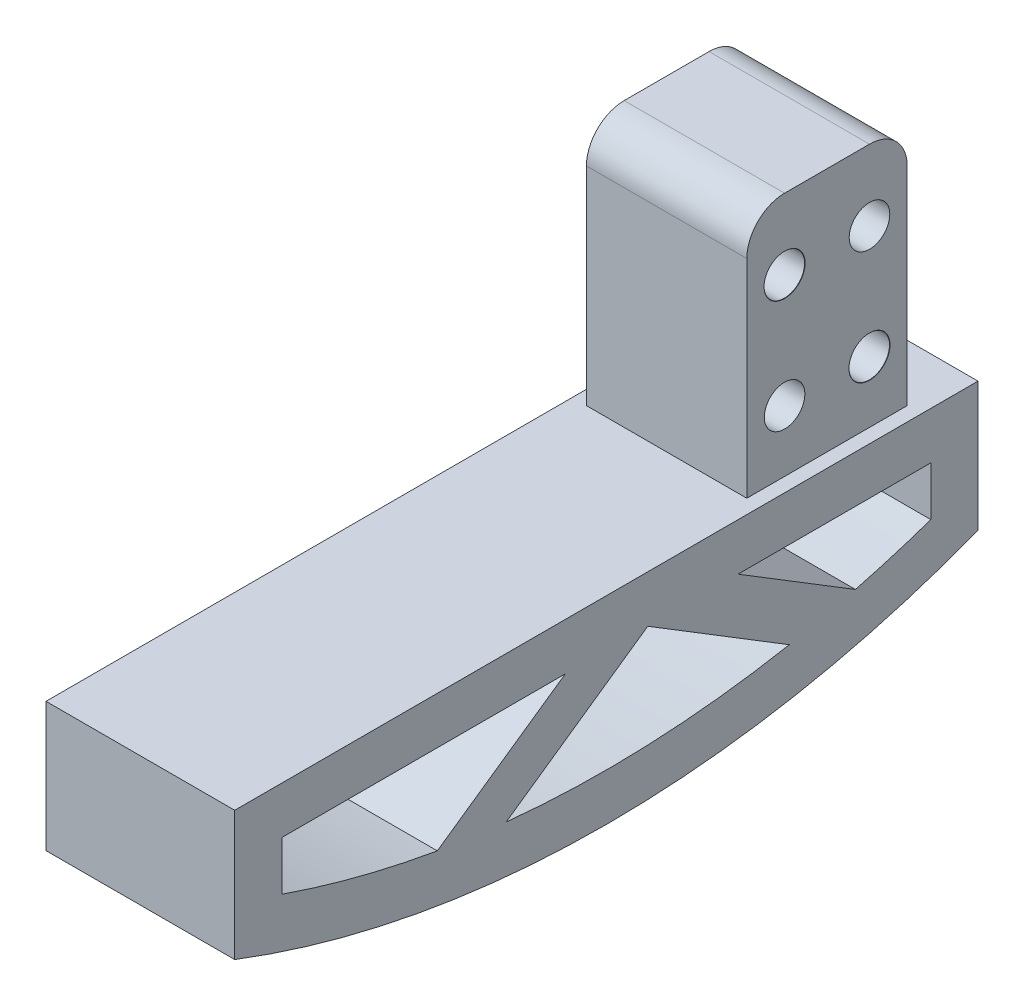
ISO-10303-21;
HEADER;
FILE_DESCRIPTION(('STEP AP214'),'2;1');
FILE_NAME('part.step','',(''),(''),'','','');
FILE_SCHEMA(('AUTOMOTIVE_DESIGN { 1 0 10303 214 1 1 1 1 }'));
ENDSEC;
DATA;
#1=APPLICATION_CONTEXT('core data for automotive mechanical design processes');
#2=APPLICATION_PROTOCOL_DEFINITION('international standard','automotive_design',2000,#1);
#3=PRODUCT_CONTEXT('',#1,'mechanical');
#4=PRODUCT('Part','Part','',(#3));
#5=PRODUCT_RELATED_PRODUCT_CATEGORY('part','',(#4));
#6=PRODUCT_DEFINITION_FORMATION('','',#4);
#7=PRODUCT_DEFINITION_CONTEXT('part definition',#1,'design');
#8=PRODUCT_DEFINITION('design','',#6,#7);
#9=PRODUCT_DEFINITION_SHAPE('','',#8);
#10=(LENGTH_UNIT() NAMED_UNIT(*) SI_UNIT(.MILLI.,.METRE.));
#11=(NAMED_UNIT(*) PLANE_ANGLE_UNIT() SI_UNIT($,.RADIAN.));
#12=(NAMED_UNIT(*) SI_UNIT($,.STERADIAN.) SOLID_ANGLE_UNIT());
#13=UNCERTAINTY_MEASURE_WITH_UNIT(LENGTH_MEASURE(1.E-05),#10,'distance_accuracy_value','');
#14=(GEOMETRIC_REPRESENTATION_CONTEXT(3) GLOBAL_UNCERTAINTY_ASSIGNED_CONTEXT((#13)) GLOBAL_UNIT_ASSIGNED_CONTEXT((#10,
#11,#12)) REPRESENTATION_CONTEXT('',''));
#15=CARTESIAN_POINT('',(0.,0.,0.));
#16=DIRECTION('',(0.,0.,1.));
#17=DIRECTION('',(1.,0.,0.));
#18=AXIS2_PLACEMENT_3D('',#15,#16,#17);
#19=CARTESIAN_POINT('',(10.,0.,0.));
#20=DIRECTION('',(1.,0.,0.));
#21=DIRECTION('',(0.,0.,-1.));
#22=AXIS2_PLACEMENT_3D('',#19,#20,#21);
#23=PLANE('',#22);
#24=DIRECTION('',(0.,-1.,0.));
#25=VECTOR('',#24,1.);
#26=CARTESIAN_POINT('',(10.,0.,73.77539685792));
#27=LINE('',#26,#25);
#28=CARTESIAN_POINT('',(10.,8.70642244995823,73.77539685792));
#29=VERTEX_POINT('',#28);
#30=CARTESIAN_POINT('',(10.,3.49711745915159,73.77539685792));
#31=VERTEX_POINT('',#30);
#32=EDGE_CURVE('E150',#29,#31,#27,.T.);
#33=ORIENTED_EDGE('',*,*,#32,.F.);
#34=DIRECTION('',(0.,0.,1.));
#35=VECTOR('',#34,1.);
#36=CARTESIAN_POINT('',(10.,8.70642244995823,0.));
#37=LINE('',#36,#35);
#38=CARTESIAN_POINT('',(10.,8.70642244995823,43.7400480506452));
#39=VERTEX_POINT('',#38);
#40=EDGE_CURVE('E290',#39,#29,#37,.T.);
#41=ORIENTED_EDGE('',*,*,#40,.F.);
#42=DIRECTION('',(0.,0.572079234693786,-0.820198359686346));
#43=VECTOR('',#42,1.);
#44=CARTESIAN_POINT('',(10.,26.380668628369,18.4002229965432));
#45=LINE('',#44,#43);
#46=CARTESIAN_POINT('',(10.,-0.753851614440859,57.3033812381479));
#47=VERTEX_POINT('',#46);
#48=EDGE_CURVE('E273',#47,#39,#45,.T.);
#49=ORIENTED_EDGE('',*,*,#48,.F.);
#50=CARTESIAN_POINT('',(10.,102.706422449958,39.38769842896));
#51=DIRECTION('',(1.,0.,0.));
#52=DIRECTION('',(0.,0.,-1.));
#53=AXIS2_PLACEMENT_3D('',#50,#51,#52);
#54=CIRCLE('',#53,105.);
#55=EDGE_CURVE('E284',#31,#47,#54,.T.);
#56=ORIENTED_EDGE('',*,*,#55,.F.);
#57=EDGE_LOOP('',(#33,#41,#49,#56));
#58=FACE_BOUND('',#57,.T.);
#59=CARTESIAN_POINT('',(10.,102.706422449958,39.38769842896));
#60=DIRECTION('',(1.,0.,0.));
#61=DIRECTION('',(0.,0.,-1.));
#62=AXIS2_PLACEMENT_3D('',#59,#60,#61);
#63=CIRCLE('',#62,110.);
#64=CARTESIAN_POINT('',(10.,-1.110222993928E-13,78.7753968579199));
#65=VERTEX_POINT('',#64);
#66=CARTESIAN_POINT('',(10.,0.,0.));
#67=VERTEX_POINT('',#66);
#68=EDGE_CURVE('E446',#65,#67,#63,.T.);
#69=ORIENTED_EDGE('',*,*,#68,.T.);
#70=DIRECTION('',(0.,-1.,0.));
#71=VECTOR('',#70,1.);
#72=CARTESIAN_POINT('',(10.,0.,0.));
#73=LINE('',#72,#71);
#74=CARTESIAN_POINT('',(10.,13.7064224499583,0.));
#75=VERTEX_POINT('',#74);
#76=EDGE_CURVE('E448',#75,#67,#73,.T.);
#77=ORIENTED_EDGE('',*,*,#76,.F.);
#78=DIRECTION('',(0.,0.,1.));
#79=VECTOR('',#78,1.);
#80=CARTESIAN_POINT('',(10.,13.7064224499583,0.));
#81=LINE('',#80,#79);
#82=CARTESIAN_POINT('',(10.,13.7064224499582,78.77539685792));
#83=VERTEX_POINT('',#82);
#84=EDGE_CURVE('E451',#75,#83,#81,.T.);
#85=ORIENTED_EDGE('',*,*,#84,.T.);
#86=DIRECTION('',(0.,-1.,0.));
#87=VECTOR('',#86,1.);
#88=CARTESIAN_POINT('',(10.,-3.19041163676933E-13,78.7753968579199));
#89=LINE('',#88,#87);
#90=EDGE_CURVE('E453',#83,#65,#89,.T.);
#91=ORIENTED_EDGE('',*,*,#90,.T.);
#92=EDGE_LOOP('',(#69,#77,#85,#91));
#93=FACE_BOUND('',#92,.T.);
#94=CARTESIAN_POINT('',(10.,102.706422449958,39.38769842896));
#95=DIRECTION('',(1.,0.,0.));
#96=DIRECTION('',(0.,0.,-1.));
#97=AXIS2_PLACEMENT_3D('',#94,#95,#96);
#98=CIRCLE('',#97,105.);
#99=CARTESIAN_POINT('',(10.,1.07905644535032,12.9892424330982));
#100=VERTEX_POINT('',#99);
#101=CARTESIAN_POINT('',(10.,3.4971174591516,5.00000000000001));
#102=VERTEX_POINT('',#101);
#103=EDGE_CURVE('E332',#100,#102,#98,.T.);
#104=ORIENTED_EDGE('',*,*,#103,.F.);
#105=DIRECTION('',(0.,0.522603841769889,0.852575641551735));
#106=VECTOR('',#105,1.);
#107=CARTESIAN_POINT('',(10.,-5.00312765312794,3.06677038958212));
#108=LINE('',#107,#106);
#109=CARTESIAN_POINT('',(10.,8.70642244995823,25.4325234520538));
#110=VERTEX_POINT('',#109);
#111=EDGE_CURVE('E326',#100,#110,#108,.T.);
#112=ORIENTED_EDGE('',*,*,#111,.T.);
#113=DIRECTION('',(0.,0.,1.));
#114=VECTOR('',#113,1.);
#115=CARTESIAN_POINT('',(10.,8.70642244995834,0.));
#116=LINE('',#115,#114);
#117=CARTESIAN_POINT('',(10.,8.70642244995834,5.00000000000001));
#118=VERTEX_POINT('',#117);
#119=EDGE_CURVE('E338',#118,#110,#116,.T.);
#120=ORIENTED_EDGE('',*,*,#119,.F.);
#121=DIRECTION('',(0.,-1.,0.));
#122=VECTOR('',#121,1.);
#123=CARTESIAN_POINT('',(10.,0.,5.00000000000001));
#124=LINE('',#123,#122);
#125=EDGE_CURVE('E335',#118,#102,#124,.T.);
#126=ORIENTED_EDGE('',*,*,#125,.T.);
#127=EDGE_LOOP('',(#104,#112,#120,#126));
#128=FACE_BOUND('',#127,.T.);
#129=CARTESIAN_POINT('',(10.,102.706422449958,39.38769842896));
#130=DIRECTION('',(1.,0.,0.));
#131=DIRECTION('',(0.,0.,-1.));
#132=AXIS2_PLACEMENT_3D('',#129,#130,#131);
#133=CIRCLE('',#132,105.);
#134=CARTESIAN_POINT('',(10.,-1.75591073940382,50.));
#135=VERTEX_POINT('',#134);
#136=CARTESIAN_POINT('',(10.,-0.488137240113096,20.));
#137=VERTEX_POINT('',#136);
#138=EDGE_CURVE('E309',#135,#137,#133,.T.);
#139=ORIENTED_EDGE('',*,*,#138,.F.);
#140=DIRECTION('',(0.,0.572079234693786,-0.820198359686346));
#141=VECTOR('',#140,1.);
#142=CARTESIAN_POINT('',(10.,22.2796768299371,15.5398268230742));
#143=LINE('',#142,#141);
#144=CARTESIAN_POINT('',(10.,8.70642244995823,35.));
#145=VERTEX_POINT('',#144);
#146=EDGE_CURVE('E142',#135,#145,#143,.T.);
#147=ORIENTED_EDGE('',*,*,#146,.T.);
#148=DIRECTION('',(0.,-0.522603841769888,-0.852575641551736));
#149=VECTOR('',#148,1.);
#150=CARTESIAN_POINT('',(10.,-9.26600586088655,5.67978959843153));
#151=LINE('',#150,#149);
#152=EDGE_CURVE('E312',#145,#137,#151,.T.);
#153=ORIENTED_EDGE('',*,*,#152,.T.);
#154=EDGE_LOOP('',(#139,#147,#153));
#155=FACE_BOUND('',#154,.T.);
#156=ADVANCED_FACE('F125',(#58,#93,#128,#155),#23,.T.);
#157=CARTESIAN_POINT('',(-10.,0.,0.));
#158=DIRECTION('',(1.,0.,0.));
#159=DIRECTION('',(0.,0.,-1.));
#160=AXIS2_PLACEMENT_3D('',#157,#158,#159);
#161=PLANE('',#160);
#162=DIRECTION('',(0.,0.522603841769889,0.852575641551735));
#163=VECTOR('',#162,1.);
#164=CARTESIAN_POINT('',(-10.,-5.00312765312794,3.06677038958212));
#165=LINE('',#164,#163);
#166=CARTESIAN_POINT('',(-10.,1.07905644535022,12.9892424330982));
#167=VERTEX_POINT('',#166);
#168=CARTESIAN_POINT('',(-10.,8.70642244995823,25.4325234520538));
#169=VERTEX_POINT('',#168);
#170=EDGE_CURVE('E341',#167,#169,#165,.T.);
#171=ORIENTED_EDGE('',*,*,#170,.F.);
#172=CARTESIAN_POINT('',(-10.,102.706422449958,39.38769842896));
#173=DIRECTION('',(1.,0.,0.));
#174=DIRECTION('',(0.,0.,-1.));
#175=AXIS2_PLACEMENT_3D('',#172,#173,#174);
#176=CIRCLE('',#175,105.);
#177=CARTESIAN_POINT('',(-10.,3.4971174591516,5.00000000000001));
#178=VERTEX_POINT('',#177);
#179=EDGE_CURVE('E343',#167,#178,#176,.T.);
#180=ORIENTED_EDGE('',*,*,#179,.T.);
#181=DIRECTION('',(0.,-1.,0.));
#182=VECTOR('',#181,1.);
#183=CARTESIAN_POINT('',(-10.,0.,5.00000000000001));
#184=LINE('',#183,#182);
#185=CARTESIAN_POINT('',(-10.,8.70642244995834,5.00000000000001));
#186=VERTEX_POINT('',#185);
#187=EDGE_CURVE('E346',#186,#178,#184,.T.);
#188=ORIENTED_EDGE('',*,*,#187,.F.);
#189=DIRECTION('',(0.,0.,1.));
#190=VECTOR('',#189,1.);
#191=CARTESIAN_POINT('',(-10.,8.70642244995834,0.));
#192=LINE('',#191,#190);
#193=EDGE_CURVE('E349',#186,#169,#192,.T.);
#194=ORIENTED_EDGE('',*,*,#193,.T.);
#195=EDGE_LOOP('',(#171,#180,#188,#194));
#196=FACE_BOUND('',#195,.T.);
#197=CARTESIAN_POINT('',(-10.,102.706422449958,39.38769842896));
#198=DIRECTION('',(1.,0.,0.));
#199=DIRECTION('',(0.,0.,-1.));
#200=AXIS2_PLACEMENT_3D('',#197,#198,#199);
#201=CIRCLE('',#200,110.);
#202=CARTESIAN_POINT('',(-10.,-1.110222993928E-13,78.7753968579199));
#203=VERTEX_POINT('',#202);
#204=CARTESIAN_POINT('',(-10.,0.,0.));
#205=VERTEX_POINT('',#204);
#206=EDGE_CURVE('E434',#203,#205,#201,.T.);
#207=ORIENTED_EDGE('',*,*,#206,.F.);
#208=DIRECTION('',(0.,-1.,0.));
#209=VECTOR('',#208,1.);
#210=CARTESIAN_POINT('',(-10.,-3.19041163676933E-13,78.7753968579199));
#211=LINE('',#210,#209);
#212=CARTESIAN_POINT('',(-10.,13.7064224499582,78.77539685792));
#213=VERTEX_POINT('',#212);
#214=EDGE_CURVE('E443',#213,#203,#211,.T.);
#215=ORIENTED_EDGE('',*,*,#214,.F.);
#216=DIRECTION('',(0.,0.,1.));
#217=VECTOR('',#216,1.);
#218=CARTESIAN_POINT('',(-10.,13.7064224499583,0.));
#219=LINE('',#218,#217);
#220=CARTESIAN_POINT('',(-10.,13.7064224499583,0.));
#221=VERTEX_POINT('',#220);
#222=EDGE_CURVE('E440',#221,#213,#219,.T.);
#223=ORIENTED_EDGE('',*,*,#222,.F.);
#224=DIRECTION('',(0.,-1.,0.));
#225=VECTOR('',#224,1.);
#226=CARTESIAN_POINT('',(-10.,0.,0.));
#227=LINE('',#226,#225);
#228=EDGE_CURVE('E437',#221,#205,#227,.T.);
#229=ORIENTED_EDGE('',*,*,#228,.T.);
#230=EDGE_LOOP('',(#207,#215,#223,#229));
#231=FACE_BOUND('',#230,.T.);
#232=DIRECTION('',(0.,0.,1.));
#233=VECTOR('',#232,1.);
#234=CARTESIAN_POINT('',(-10.,8.70642244995823,0.));
#235=LINE('',#234,#233);
#236=CARTESIAN_POINT('',(-10.,8.70642244995823,43.7400480506452));
#237=VERTEX_POINT('',#236);
#238=CARTESIAN_POINT('',(-10.,8.70642244995823,73.77539685792));
#239=VERTEX_POINT('',#238);
#240=EDGE_CURVE('E301',#237,#239,#235,.T.);
#241=ORIENTED_EDGE('',*,*,#240,.T.);
#242=DIRECTION('',(0.,-1.,0.));
#243=VECTOR('',#242,1.);
#244=CARTESIAN_POINT('',(-10.,0.,73.77539685792));
#245=LINE('',#244,#243);
#246=CARTESIAN_POINT('',(-10.,3.4971174591516,73.77539685792));
#247=VERTEX_POINT('',#246);
#248=EDGE_CURVE('E292',#239,#247,#245,.T.);
#249=ORIENTED_EDGE('',*,*,#248,.T.);
#250=CARTESIAN_POINT('',(-10.,102.706422449958,39.38769842896));
#251=DIRECTION('',(1.,0.,0.));
#252=DIRECTION('',(0.,0.,-1.));
#253=AXIS2_PLACEMENT_3D('',#250,#251,#252);
#254=CIRCLE('',#253,105.);
#255=CARTESIAN_POINT('',(-10.,-0.753851614440804,57.3033812381479));
#256=VERTEX_POINT('',#255);
#257=EDGE_CURVE('E298',#247,#256,#254,.T.);
#258=ORIENTED_EDGE('',*,*,#257,.T.);
#259=DIRECTION('',(0.,0.572079234693786,-0.820198359686346));
#260=VECTOR('',#259,1.);
#261=CARTESIAN_POINT('',(-10.,26.380668628369,18.4002229965432));
#262=LINE('',#261,#260);
#263=EDGE_CURVE('E276',#256,#237,#262,.T.);
#264=ORIENTED_EDGE('',*,*,#263,.T.);
#265=EDGE_LOOP('',(#241,#249,#258,#264));
#266=FACE_BOUND('',#265,.T.);
#267=DIRECTION('',(0.,0.572079234693786,-0.820198359686346));
#268=VECTOR('',#267,1.);
#269=CARTESIAN_POINT('',(-10.,22.2796768299371,15.5398268230742));
#270=LINE('',#269,#268);
#271=CARTESIAN_POINT('',(-10.,-1.75591073940384,50.));
#272=VERTEX_POINT('',#271);
#273=CARTESIAN_POINT('',(-10.,8.70642244995823,35.));
#274=VERTEX_POINT('',#273);
#275=EDGE_CURVE('E315',#272,#274,#270,.T.);
#276=ORIENTED_EDGE('',*,*,#275,.F.);
#277=CARTESIAN_POINT('',(-10.,102.706422449958,39.38769842896));
#278=DIRECTION('',(1.,0.,0.));
#279=DIRECTION('',(0.,0.,-1.));
#280=AXIS2_PLACEMENT_3D('',#277,#278,#279);
#281=CIRCLE('',#280,105.);
#282=CARTESIAN_POINT('',(-10.,-0.488137240113096,20.));
#283=VERTEX_POINT('',#282);
#284=EDGE_CURVE('E317',#272,#283,#281,.T.);
#285=ORIENTED_EDGE('',*,*,#284,.T.);
#286=DIRECTION('',(0.,-0.522603841769888,-0.852575641551736));
#287=VECTOR('',#286,1.);
#288=CARTESIAN_POINT('',(-10.,-9.26600586088655,5.67978959843153));
#289=LINE('',#288,#287);
#290=EDGE_CURVE('E320',#274,#283,#289,.T.);
#291=ORIENTED_EDGE('',*,*,#290,.F.);
#292=EDGE_LOOP('',(#276,#285,#291));
#293=FACE_BOUND('',#292,.T.);
#294=ADVANCED_FACE('F486',(#196,#231,#266,#293),#161,.F.);
#295=CARTESIAN_POINT('',(10.,102.706422449958,39.38769842896));
#296=DIRECTION('',(-1.,0.,0.));
#297=DIRECTION('',(0.,0.,1.));
#298=AXIS2_PLACEMENT_3D('',#295,#296,#297);
#299=CYLINDRICAL_SURFACE('',#298,110.);
#300=DIRECTION('',(-1.,0.,0.));
#301=VECTOR('',#300,1.);
#302=CARTESIAN_POINT('',(10.,-1.110222993928E-13,78.7753968579199));
#303=LINE('',#302,#301);
#304=EDGE_CURVE('E455',#65,#203,#303,.T.);
#305=ORIENTED_EDGE('',*,*,#304,.T.);
#306=ORIENTED_EDGE('',*,*,#206,.T.);
#307=DIRECTION('',(-1.,0.,0.));
#308=VECTOR('',#307,1.);
#309=CARTESIAN_POINT('',(10.,0.,0.));
#310=LINE('',#309,#308);
#311=EDGE_CURVE('E12',#67,#205,#310,.T.);
#312=ORIENTED_EDGE('',*,*,#311,.F.);
#313=ORIENTED_EDGE('',*,*,#68,.F.);
#314=EDGE_LOOP('',(#305,#306,#312,#313));
#315=FACE_BOUND('',#314,.T.);
#316=ADVANCED_FACE('F127',(#315),#299,.T.);
#317=CARTESIAN_POINT('',(10.,0.,0.));
#318=DIRECTION('',(0.,0.,-1.));
#319=DIRECTION('',(0.,1.,0.));
#320=AXIS2_PLACEMENT_3D('',#317,#318,#319);
#321=PLANE('',#320);
#322=ORIENTED_EDGE('',*,*,#311,.T.);
#323=ORIENTED_EDGE('',*,*,#228,.F.);
#324=DIRECTION('',(-1.,0.,0.));
#325=VECTOR('',#324,1.);
#326=CARTESIAN_POINT('',(10.,13.7064224499583,0.));
#327=LINE('',#326,#325);
#328=EDGE_CURVE('E134',#75,#221,#327,.T.);
#329=ORIENTED_EDGE('',*,*,#328,.F.);
#330=ORIENTED_EDGE('',*,*,#76,.T.);
#331=EDGE_LOOP('',(#322,#323,#329,#330));
#332=FACE_BOUND('',#331,.T.);
#333=ADVANCED_FACE('F502',(#332),#321,.T.);
#334=CARTESIAN_POINT('',(10.,13.7064224499583,0.));
#335=DIRECTION('',(0.,-1.,0.));
#336=DIRECTION('',(0.,0.,-1.));
#337=AXIS2_PLACEMENT_3D('',#334,#335,#336);
#338=PLANE('',#337);
#339=DIRECTION('',(-1.,0.,0.));
#340=VECTOR('',#339,1.);
#341=CARTESIAN_POINT('',(8.50000000000001,13.7064224499583,6.00000000000004));
#342=LINE('',#341,#340);
#343=CARTESIAN_POINT('',(8.50000000000001,13.7064224499583,6.00000000000004));
#344=VERTEX_POINT('',#343);
#345=CARTESIAN_POINT('',(-8.50000000000001,13.7064224499583,6.00000000000004));
#346=VERTEX_POINT('',#345);
#347=EDGE_CURVE('E403',#344,#346,#342,.T.);
#348=ORIENTED_EDGE('',*,*,#347,.F.);
#349=DIRECTION('',(0.,0.,1.));
#350=VECTOR('',#349,1.);
#351=CARTESIAN_POINT('',(8.50000000000001,13.7064224499584,0.));
#352=LINE('',#351,#350);
#353=CARTESIAN_POINT('',(8.50000000000001,13.7064224499583,23.));
#354=VERTEX_POINT('',#353);
#355=EDGE_CURVE('E401',#344,#354,#352,.T.);
#356=ORIENTED_EDGE('',*,*,#355,.T.);
#357=DIRECTION('',(-1.,0.,0.));
#358=VECTOR('',#357,1.);
#359=CARTESIAN_POINT('',(8.50000000000001,13.7064224499582,23.0000000000001));
#360=LINE('',#359,#358);
#361=CARTESIAN_POINT('',(-8.50000000000001,13.7064224499582,23.0000000000001));
#362=VERTEX_POINT('',#361);
#363=EDGE_CURVE('E420',#354,#362,#360,.T.);
#364=ORIENTED_EDGE('',*,*,#363,.T.);
#365=DIRECTION('',(0.,0.,1.));
#366=VECTOR('',#365,1.);
#367=CARTESIAN_POINT('',(-8.50000000000001,13.7064224499584,0.));
#368=LINE('',#367,#366);
#369=EDGE_CURVE('E392',#346,#362,#368,.T.);
#370=ORIENTED_EDGE('',*,*,#369,.F.);
#371=EDGE_LOOP('',(#348,#356,#364,#370));
#372=FACE_BOUND('',#371,.T.);
#373=ORIENTED_EDGE('',*,*,#328,.T.);
#374=ORIENTED_EDGE('',*,*,#222,.T.);
#375=DIRECTION('',(-1.,0.,0.));
#376=VECTOR('',#375,1.);
#377=CARTESIAN_POINT('',(10.,13.7064224499582,78.77539685792));
#378=LINE('',#377,#376);
#379=EDGE_CURVE('E457',#83,#213,#378,.T.);
#380=ORIENTED_EDGE('',*,*,#379,.F.);
#381=ORIENTED_EDGE('',*,*,#84,.F.);
#382=EDGE_LOOP('',(#373,#374,#380,#381));
#383=FACE_BOUND('',#382,.T.);
#384=ADVANCED_FACE('F499',(#372,#383),#338,.F.);
#385=CARTESIAN_POINT('',(10.,-3.19041163676933E-13,78.7753968579199));
#386=DIRECTION('',(0.,0.,-1.));
#387=DIRECTION('',(0.,1.,0.));
#388=AXIS2_PLACEMENT_3D('',#385,#386,#387);
#389=PLANE('',#388);
#390=ORIENTED_EDGE('',*,*,#379,.T.);
#391=ORIENTED_EDGE('',*,*,#214,.T.);
#392=ORIENTED_EDGE('',*,*,#304,.F.);
#393=ORIENTED_EDGE('',*,*,#90,.F.);
#394=EDGE_LOOP('',(#390,#391,#392,#393));
#395=FACE_BOUND('',#394,.T.);
#396=ADVANCED_FACE('F495',(#395),#389,.F.);
#397=CARTESIAN_POINT('',(8.50000000000001,0.,6.00000000000001));
#398=DIRECTION('',(0.,0.,1.));
#399=DIRECTION('',(0.,-1.,0.));
#400=AXIS2_PLACEMENT_3D('',#397,#398,#399);
#401=PLANE('',#400);
#402=DIRECTION('',(0.,1.,0.));
#403=VECTOR('',#402,1.);
#404=CARTESIAN_POINT('',(-8.50000000000001,0.,6.00000000000001));
#405=LINE('',#404,#403);
#406=CARTESIAN_POINT('',(-8.50000000000001,35.7064224487719,6.0000000000001));
#407=VERTEX_POINT('',#406);
#408=EDGE_CURVE('E404',#346,#407,#405,.T.);
#409=ORIENTED_EDGE('',*,*,#408,.T.);
#410=DIRECTION('',(-1.,0.,0.));
#411=VECTOR('',#410,1.);
#412=CARTESIAN_POINT('',(8.50000000000001,35.7064224487719,6.0000000000001));
#413=LINE('',#412,#411);
#414=CARTESIAN_POINT('',(8.50000000000001,35.7064224487719,6.0000000000001));
#415=VERTEX_POINT('',#414);
#416=EDGE_CURVE('E431',#415,#407,#413,.T.);
#417=ORIENTED_EDGE('',*,*,#416,.F.);
#418=DIRECTION('',(0.,1.,0.));
#419=VECTOR('',#418,1.);
#420=CARTESIAN_POINT('',(8.50000000000001,0.,6.00000000000001));
#421=LINE('',#420,#419);
#422=EDGE_CURVE('E388',#344,#415,#421,.T.);
#423=ORIENTED_EDGE('',*,*,#422,.F.);
#424=ORIENTED_EDGE('',*,*,#347,.T.);
#425=EDGE_LOOP('',(#409,#417,#423,#424));
#426=FACE_BOUND('',#425,.T.);
#427=ADVANCED_FACE('F498',(#426),#401,.F.);
#428=CARTESIAN_POINT('',(8.50000000000001,35.7064224487719,10.));
#429=DIRECTION('',(-1.,0.,0.));
#430=DIRECTION('',(0.,0.,1.));
#431=AXIS2_PLACEMENT_3D('',#428,#429,#430);
#432=CYLINDRICAL_SURFACE('',#431,3.99999999999992);
#433=CARTESIAN_POINT('',(-8.50000000000001,35.7064224487719,10.));
#434=DIRECTION('',(1.,0.,0.));
#435=DIRECTION('',(0.,0.,-1.));
#436=AXIS2_PLACEMENT_3D('',#433,#434,#435);
#437=CIRCLE('',#436,3.99999999999992);
#438=CARTESIAN_POINT('',(-8.50000000000001,39.7064224487718,10.));
#439=VERTEX_POINT('',#438);
#440=EDGE_CURVE('E407',#407,#439,#437,.T.);
#441=ORIENTED_EDGE('',*,*,#440,.T.);
#442=DIRECTION('',(-1.,0.,0.));
#443=VECTOR('',#442,1.);
#444=CARTESIAN_POINT('',(8.50000000000001,39.7064224487718,10.));
#445=LINE('',#444,#443);
#446=CARTESIAN_POINT('',(8.50000000000001,39.7064224487718,10.));
#447=VERTEX_POINT('',#446);
#448=EDGE_CURVE('E428',#447,#439,#445,.T.);
#449=ORIENTED_EDGE('',*,*,#448,.F.);
#450=CARTESIAN_POINT('',(8.50000000000001,35.7064224487719,10.));
#451=DIRECTION('',(1.,0.,0.));
#452=DIRECTION('',(0.,0.,-1.));
#453=AXIS2_PLACEMENT_3D('',#450,#451,#452);
#454=CIRCLE('',#453,3.99999999999992);
#455=EDGE_CURVE('E391',#415,#447,#454,.T.);
#456=ORIENTED_EDGE('',*,*,#455,.F.);
#457=ORIENTED_EDGE('',*,*,#416,.T.);
#458=EDGE_LOOP('',(#441,#449,#456,#457));
#459=FACE_BOUND('',#458,.T.);
#460=ADVANCED_FACE('F605',(#459),#432,.T.);
#461=CARTESIAN_POINT('',(8.50000000000001,39.7064224487716,-4.89810938090216E-13));
#462=DIRECTION('',(0.,-1.,0.));
#463=DIRECTION('',(0.,0.,-1.));
#464=AXIS2_PLACEMENT_3D('',#461,#462,#463);
#465=PLANE('',#464);
#466=DIRECTION('',(0.,0.,1.));
#467=VECTOR('',#466,1.);
#468=CARTESIAN_POINT('',(-8.50000000000001,39.7064224487716,-4.89810938090216E-13));
#469=LINE('',#468,#467);
#470=CARTESIAN_POINT('',(-8.50000000000001,39.7064224487719,19.0000000000001));
#471=VERTEX_POINT('',#470);
#472=EDGE_CURVE('E409',#439,#471,#469,.T.);
#473=ORIENTED_EDGE('',*,*,#472,.T.);
#474=DIRECTION('',(-1.,0.,0.));
#475=VECTOR('',#474,1.);
#476=CARTESIAN_POINT('',(8.50000000000001,39.7064224487719,19.0000000000001));
#477=LINE('',#476,#475);
#478=CARTESIAN_POINT('',(8.50000000000001,39.7064224487719,19.0000000000001));
#479=VERTEX_POINT('',#478);
#480=EDGE_CURVE('E425',#479,#471,#477,.T.);
#481=ORIENTED_EDGE('',*,*,#480,.F.);
#482=DIRECTION('',(0.,0.,1.));
#483=VECTOR('',#482,1.);
#484=CARTESIAN_POINT('',(8.50000000000001,39.7064224487716,-4.89810938090216E-13));
#485=LINE('',#484,#483);
#486=EDGE_CURVE('E394',#447,#479,#485,.T.);
#487=ORIENTED_EDGE('',*,*,#486,.F.);
#488=ORIENTED_EDGE('',*,*,#448,.T.);
#489=EDGE_LOOP('',(#473,#481,#487,#488));
#490=FACE_BOUND('',#489,.T.);
#491=ADVANCED_FACE('F601',(#490),#465,.F.);
#492=CARTESIAN_POINT('',(8.50000000000001,35.7064224487719,19.0000000000001));
#493=DIRECTION('',(-1.,0.,0.));
#494=DIRECTION('',(0.,0.,1.));
#495=AXIS2_PLACEMENT_3D('',#492,#493,#494);
#496=CYLINDRICAL_SURFACE('',#495,4.);
#497=CARTESIAN_POINT('',(-8.50000000000001,35.7064224487719,19.0000000000001));
#498=DIRECTION('',(1.,0.,0.));
#499=DIRECTION('',(0.,0.,-1.));
#500=AXIS2_PLACEMENT_3D('',#497,#498,#499);
#501=CIRCLE('',#500,4.);
#502=CARTESIAN_POINT('',(-8.50000000000001,35.7064224487719,23.));
#503=VERTEX_POINT('',#502);
#504=EDGE_CURVE('E411',#471,#503,#501,.T.);
#505=ORIENTED_EDGE('',*,*,#504,.T.);
#506=DIRECTION('',(-1.,0.,0.));
#507=VECTOR('',#506,1.);
#508=CARTESIAN_POINT('',(8.50000000000001,35.7064224487719,23.));
#509=LINE('',#508,#507);
#510=CARTESIAN_POINT('',(8.50000000000001,35.7064224487719,23.));
#511=VERTEX_POINT('',#510);
#512=EDGE_CURVE('E422',#511,#503,#509,.T.);
#513=ORIENTED_EDGE('',*,*,#512,.F.);
#514=CARTESIAN_POINT('',(8.50000000000001,35.7064224487719,19.0000000000001));
#515=DIRECTION('',(1.,0.,0.));
#516=DIRECTION('',(0.,0.,-1.));
#517=AXIS2_PLACEMENT_3D('',#514,#515,#516);
#518=CIRCLE('',#517,4.);
#519=EDGE_CURVE('E396',#479,#511,#518,.T.);
#520=ORIENTED_EDGE('',*,*,#519,.F.);
#521=ORIENTED_EDGE('',*,*,#480,.T.);
#522=EDGE_LOOP('',(#505,#513,#520,#521));
#523=FACE_BOUND('',#522,.T.);
#524=ADVANCED_FACE('F597',(#523),#496,.T.);
#525=CARTESIAN_POINT('',(8.50000000000001,0.,23.));
#526=DIRECTION('',(0.,0.,-1.));
#527=DIRECTION('',(-1.,0.,0.));
#528=AXIS2_PLACEMENT_3D('',#525,#526,#527);
#529=PLANE('',#528);
#530=DIRECTION('',(0.,-1.,0.));
#531=VECTOR('',#530,1.);
#532=CARTESIAN_POINT('',(-8.50000000000001,0.,23.));
#533=LINE('',#532,#531);
#534=EDGE_CURVE('E413',#503,#362,#533,.T.);
#535=ORIENTED_EDGE('',*,*,#534,.T.);
#536=ORIENTED_EDGE('',*,*,#363,.F.);
#537=DIRECTION('',(0.,-1.,0.));
#538=VECTOR('',#537,1.);
#539=CARTESIAN_POINT('',(8.50000000000001,0.,23.));
#540=LINE('',#539,#538);
#541=EDGE_CURVE('E398',#511,#354,#540,.T.);
#542=ORIENTED_EDGE('',*,*,#541,.F.);
#543=ORIENTED_EDGE('',*,*,#512,.T.);
#544=EDGE_LOOP('',(#535,#536,#542,#543));
#545=FACE_BOUND('',#544,.T.);
#546=ADVANCED_FACE('F591',(#545),#529,.F.);
#547=CARTESIAN_POINT('',(8.50000000000001,0.,0.));
#548=DIRECTION('',(1.,0.,0.));
#549=DIRECTION('',(0.,0.,-1.));
#550=AXIS2_PLACEMENT_3D('',#547,#548,#549);
#551=PLANE('',#550);
#552=CARTESIAN_POINT('',(8.50000000000001,32.2064224487718,19.0000000000001));
#553=DIRECTION('',(1.,0.,0.));
#554=DIRECTION('',(0.,0.,-1.));
#555=AXIS2_PLACEMENT_3D('',#552,#553,#554);
#556=CIRCLE('',#555,2.175);
#557=CARTESIAN_POINT('',(8.50000000000001,32.2064224487718,16.8250000000001));
#558=VERTEX_POINT('',#557);
#559=EDGE_CURVE('E355',#558,#558,#556,.T.);
#560=ORIENTED_EDGE('',*,*,#559,.F.);
#561=EDGE_LOOP('',(#560));
#562=FACE_BOUND('',#561,.T.);
#563=CARTESIAN_POINT('',(8.50000000000001,20.2064224499582,10.));
#564=DIRECTION('',(1.,0.,0.));
#565=DIRECTION('',(0.,0.,-1.));
#566=AXIS2_PLACEMENT_3D('',#563,#564,#565);
#567=CIRCLE('',#566,2.175);
#568=CARTESIAN_POINT('',(8.50000000000001,20.2064224499582,7.82500000000004));
#569=VERTEX_POINT('',#568);
#570=EDGE_CURVE('E367',#569,#569,#567,.T.);
#571=ORIENTED_EDGE('',*,*,#570,.F.);
#572=EDGE_LOOP('',(#571));
#573=FACE_BOUND('',#572,.T.);
#574=CARTESIAN_POINT('',(8.50000000000001,32.2064224487718,10.));
#575=DIRECTION('',(1.,0.,0.));
#576=DIRECTION('',(0.,0.,-1.));
#577=AXIS2_PLACEMENT_3D('',#574,#575,#576);
#578=CIRCLE('',#577,2.15);
#579=CARTESIAN_POINT('',(8.50000000000001,32.2064224487718,7.85000000000004));
#580=VERTEX_POINT('',#579);
#581=EDGE_CURVE('E380',#580,#580,#578,.T.);
#582=ORIENTED_EDGE('',*,*,#581,.F.);
#583=EDGE_LOOP('',(#582));
#584=FACE_BOUND('',#583,.T.);
#585=CARTESIAN_POINT('',(8.50000000000001,20.2064224499582,19.0000000000001));
#586=DIRECTION('',(1.,0.,0.));
#587=DIRECTION('',(0.,0.,-1.));
#588=AXIS2_PLACEMENT_3D('',#585,#586,#587);
#589=CIRCLE('',#588,2.15);
#590=CARTESIAN_POINT('',(8.50000000000001,20.2064224499582,16.8500000000001));
#591=VERTEX_POINT('',#590);
#592=EDGE_CURVE('E387',#591,#591,#589,.T.);
#593=ORIENTED_EDGE('',*,*,#592,.F.);
#594=EDGE_LOOP('',(#593));
#595=FACE_BOUND('',#594,.T.);
#596=ORIENTED_EDGE('',*,*,#422,.T.);
#597=ORIENTED_EDGE('',*,*,#455,.T.);
#598=ORIENTED_EDGE('',*,*,#486,.T.);
#599=ORIENTED_EDGE('',*,*,#519,.T.);
#600=ORIENTED_EDGE('',*,*,#541,.T.);
#601=ORIENTED_EDGE('',*,*,#355,.F.);
#602=EDGE_LOOP('',(#596,#597,#598,#599,#600,#601));
#603=FACE_BOUND('',#602,.T.);
#604=ADVANCED_FACE('F582',(#562,#573,#584,#595,#603),#551,.T.);
#605=CARTESIAN_POINT('',(-8.50000000000001,0.,0.));
#606=DIRECTION('',(1.,0.,0.));
#607=DIRECTION('',(0.,0.,-1.));
#608=AXIS2_PLACEMENT_3D('',#605,#606,#607);
#609=PLANE('',#608);
#610=CARTESIAN_POINT('',(-8.50000000000001,32.2064224487718,19.0000000000001));
#611=DIRECTION('',(1.,0.,0.));
#612=DIRECTION('',(0.,0.,-1.));
#613=AXIS2_PLACEMENT_3D('',#610,#611,#612);
#614=CIRCLE('',#613,2.15);
#615=CARTESIAN_POINT('',(-8.50000000000001,32.2064224487718,16.8500000000001));
#616=VERTEX_POINT('',#615);
#617=EDGE_CURVE('E129',#616,#616,#614,.T.);
#618=ORIENTED_EDGE('',*,*,#617,.T.);
#619=EDGE_LOOP('',(#618));
#620=FACE_BOUND('',#619,.T.);
#621=CARTESIAN_POINT('',(-8.50000000000001,20.2064224499582,10.));
#622=DIRECTION('',(1.,0.,0.));
#623=DIRECTION('',(0.,0.,-1.));
#624=AXIS2_PLACEMENT_3D('',#621,#622,#623);
#625=CIRCLE('',#624,2.15);
#626=CARTESIAN_POINT('',(-8.50000000000001,20.2064224499582,7.85000000000004));
#627=VERTEX_POINT('',#626);
#628=EDGE_CURVE('E373',#627,#627,#625,.T.);
#629=ORIENTED_EDGE('',*,*,#628,.T.);
#630=EDGE_LOOP('',(#629));
#631=FACE_BOUND('',#630,.T.);
#632=CARTESIAN_POINT('',(-8.50000000000001,32.2064224487718,10.));
#633=DIRECTION('',(-1.,0.,0.));
#634=DIRECTION('',(0.,0.,1.));
#635=AXIS2_PLACEMENT_3D('',#632,#633,#634);
#636=CIRCLE('',#635,2.175);
#637=CARTESIAN_POINT('',(-8.50000000000001,32.2064224487718,12.175));
#638=VERTEX_POINT('',#637);
#639=EDGE_CURVE('E374',#638,#638,#636,.T.);
#640=ORIENTED_EDGE('',*,*,#639,.F.);
#641=EDGE_LOOP('',(#640));
#642=FACE_BOUND('',#641,.T.);
#643=CARTESIAN_POINT('',(-8.50000000000001,20.2064224499582,19.0000000000001));
#644=DIRECTION('',(-1.,0.,0.));
#645=DIRECTION('',(0.,0.,1.));
#646=AXIS2_PLACEMENT_3D('',#643,#644,#645);
#647=CIRCLE('',#646,2.175);
#648=CARTESIAN_POINT('',(-8.50000000000001,20.2064224499582,21.1750000000001));
#649=VERTEX_POINT('',#648);
#650=EDGE_CURVE('E381',#649,#649,#647,.T.);
#651=ORIENTED_EDGE('',*,*,#650,.F.);
#652=EDGE_LOOP('',(#651));
#653=FACE_BOUND('',#652,.T.);
#654=ORIENTED_EDGE('',*,*,#408,.F.);
#655=ORIENTED_EDGE('',*,*,#369,.T.);
#656=ORIENTED_EDGE('',*,*,#534,.F.);
#657=ORIENTED_EDGE('',*,*,#504,.F.);
#658=ORIENTED_EDGE('',*,*,#472,.F.);
#659=ORIENTED_EDGE('',*,*,#440,.F.);
#660=EDGE_LOOP('',(#654,#655,#656,#657,#658,#659));
#661=FACE_BOUND('',#660,.T.);
#662=ADVANCED_FACE('F466',(#620,#631,#642,#653,#661),#609,.F.);
#663=CARTESIAN_POINT('',(-8.50000000000001,20.2064224499582,19.0000000000001));
#664=DIRECTION('',(-1.,0.,0.));
#665=DIRECTION('',(0.,0.,1.));
#666=AXIS2_PLACEMENT_3D('',#663,#664,#665);
#667=CYLINDRICAL_SURFACE('',#666,2.15);
#668=ORIENTED_EDGE('',*,*,#592,.T.);
#669=EDGE_LOOP('',(#668));
#670=FACE_BOUND('',#669,.T.);
#671=CARTESIAN_POINT('',(-8.47500000000001,20.2064224499582,19.0000000000001));
#672=DIRECTION('',(-1.,0.,0.));
#673=DIRECTION('',(0.,0.,1.));
#674=AXIS2_PLACEMENT_3D('',#671,#672,#673);
#675=CIRCLE('',#674,2.15);
#676=CARTESIAN_POINT('',(-8.47500000000001,20.2064224499582,21.1500000000001));
#677=VERTEX_POINT('',#676);
#678=EDGE_CURVE('E384',#677,#677,#675,.T.);
#679=ORIENTED_EDGE('',*,*,#678,.T.);
#680=EDGE_LOOP('',(#679));
#681=FACE_BOUND('',#680,.T.);
#682=ADVANCED_FACE('F581',(#670,#681),#667,.F.);
#683=CARTESIAN_POINT('',(-8.50000000000001,20.2064224499582,19.0000000000001));
#684=DIRECTION('',(-1.,0.,0.));
#685=DIRECTION('',(0.,0.,1.));
#686=AXIS2_PLACEMENT_3D('',#683,#684,#685);
#687=CONICAL_SURFACE('',#686,2.175,0.785398163397448);
#688=ORIENTED_EDGE('',*,*,#678,.F.);
#689=EDGE_LOOP('',(#688));
#690=FACE_BOUND('',#689,.T.);
#691=ORIENTED_EDGE('',*,*,#650,.T.);
#692=EDGE_LOOP('',(#691));
#693=FACE_BOUND('',#692,.T.);
#694=ADVANCED_FACE('F588',(#690,#693),#687,.F.);
#695=CARTESIAN_POINT('',(-8.50000000000001,32.2064224487718,10.));
#696=DIRECTION('',(-1.,0.,0.));
#697=DIRECTION('',(0.,0.,1.));
#698=AXIS2_PLACEMENT_3D('',#695,#696,#697);
#699=CYLINDRICAL_SURFACE('',#698,2.15);
#700=ORIENTED_EDGE('',*,*,#581,.T.);
#701=EDGE_LOOP('',(#700));
#702=FACE_BOUND('',#701,.T.);
#703=CARTESIAN_POINT('',(-8.47500000000001,32.2064224487718,10.));
#704=DIRECTION('',(-1.,0.,0.));
#705=DIRECTION('',(0.,0.,1.));
#706=AXIS2_PLACEMENT_3D('',#703,#704,#705);
#707=CIRCLE('',#706,2.15);
#708=CARTESIAN_POINT('',(-8.47500000000001,32.2064224487718,12.15));
#709=VERTEX_POINT('',#708);
#710=EDGE_CURVE('E377',#709,#709,#707,.T.);
#711=ORIENTED_EDGE('',*,*,#710,.T.);
#712=EDGE_LOOP('',(#711));
#713=FACE_BOUND('',#712,.T.);
#714=ADVANCED_FACE('F482',(#702,#713),#699,.F.);
#715=CARTESIAN_POINT('',(-8.50000000000001,32.2064224487718,10.));
#716=DIRECTION('',(-1.,0.,0.));
#717=DIRECTION('',(0.,0.,1.));
#718=AXIS2_PLACEMENT_3D('',#715,#716,#717);
#719=CONICAL_SURFACE('',#718,2.175,0.785398163397379);
#720=ORIENTED_EDGE('',*,*,#710,.F.);
#721=EDGE_LOOP('',(#720));
#722=FACE_BOUND('',#721,.T.);
#723=ORIENTED_EDGE('',*,*,#639,.T.);
#724=EDGE_LOOP('',(#723));
#725=FACE_BOUND('',#724,.T.);
#726=ADVANCED_FACE('F472',(#722,#725),#719,.F.);
#727=CARTESIAN_POINT('',(8.50000000000001,20.2064224499582,10.));
#728=DIRECTION('',(1.,0.,0.));
#729=DIRECTION('',(0.,0.,-1.));
#730=AXIS2_PLACEMENT_3D('',#727,#728,#729);
#731=CYLINDRICAL_SURFACE('',#730,2.15);
#732=CARTESIAN_POINT('',(8.475,20.2064224499582,10.));
#733=DIRECTION('',(1.,0.,0.));
#734=DIRECTION('',(0.,0.,-1.));
#735=AXIS2_PLACEMENT_3D('',#732,#733,#734);
#736=CIRCLE('',#735,2.15);
#737=CARTESIAN_POINT('',(8.475,20.2064224499582,7.85000000000004));
#738=VERTEX_POINT('',#737);
#739=EDGE_CURVE('E370',#738,#738,#736,.T.);
#740=ORIENTED_EDGE('',*,*,#739,.T.);
#741=EDGE_LOOP('',(#740));
#742=FACE_BOUND('',#741,.T.);
#743=ORIENTED_EDGE('',*,*,#628,.F.);
#744=EDGE_LOOP('',(#743));
#745=FACE_BOUND('',#744,.T.);
#746=ADVANCED_FACE('F469',(#742,#745),#731,.F.);
#747=CARTESIAN_POINT('',(8.50000000000001,20.2064224499582,10.));
#748=DIRECTION('',(1.,0.,0.));
#749=DIRECTION('',(0.,0.,-1.));
#750=AXIS2_PLACEMENT_3D('',#747,#748,#749);
#751=CONICAL_SURFACE('',#750,2.175,0.785398163397379);
#752=ORIENTED_EDGE('',*,*,#739,.F.);
#753=EDGE_LOOP('',(#752));
#754=FACE_BOUND('',#753,.T.);
#755=ORIENTED_EDGE('',*,*,#570,.T.);
#756=EDGE_LOOP('',(#755));
#757=FACE_BOUND('',#756,.T.);
#758=ADVANCED_FACE('F471',(#754,#757),#751,.F.);
#759=CARTESIAN_POINT('',(8.50000000000001,32.2064224487718,19.0000000000001));
#760=DIRECTION('',(1.,0.,0.));
#761=DIRECTION('',(0.,0.,-1.));
#762=AXIS2_PLACEMENT_3D('',#759,#760,#761);
#763=CYLINDRICAL_SURFACE('',#762,2.15);
#764=CARTESIAN_POINT('',(8.475,32.2064224487718,19.0000000000001));
#765=DIRECTION('',(1.,0.,0.));
#766=DIRECTION('',(0.,0.,-1.));
#767=AXIS2_PLACEMENT_3D('',#764,#765,#766);
#768=CIRCLE('',#767,2.15);
#769=CARTESIAN_POINT('',(8.475,32.2064224487718,16.8500000000001));
#770=VERTEX_POINT('',#769);
#771=EDGE_CURVE('E364',#770,#770,#768,.T.);
#772=ORIENTED_EDGE('',*,*,#771,.T.);
#773=EDGE_LOOP('',(#772));
#774=FACE_BOUND('',#773,.T.);
#775=ORIENTED_EDGE('',*,*,#617,.F.);
#776=EDGE_LOOP('',(#775));
#777=FACE_BOUND('',#776,.T.);
#778=ADVANCED_FACE('F479',(#774,#777),#763,.F.);
#779=CARTESIAN_POINT('',(8.50000000000001,32.2064224487718,19.0000000000001));
#780=DIRECTION('',(1.,0.,0.));
#781=DIRECTION('',(0.,0.,-1.));
#782=AXIS2_PLACEMENT_3D('',#779,#780,#781);
#783=CONICAL_SURFACE('',#782,2.175,0.78539816339731);
#784=ORIENTED_EDGE('',*,*,#771,.F.);
#785=EDGE_LOOP('',(#784));
#786=FACE_BOUND('',#785,.T.);
#787=ORIENTED_EDGE('',*,*,#559,.T.);
#788=EDGE_LOOP('',(#787));
#789=FACE_BOUND('',#788,.T.);
#790=ADVANCED_FACE('F566',(#786,#789),#783,.F.);
#791=CARTESIAN_POINT('',(-10.,-5.00312765312794,3.06677038958212));
#792=DIRECTION('',(0.,0.852575641551735,-0.522603841769889));
#793=DIRECTION('',(0.,0.522603841769889,0.852575641551735));
#794=AXIS2_PLACEMENT_3D('',#791,#792,#793);
#795=PLANE('',#794);
#796=DIRECTION('',(1.,0.,0.));
#797=VECTOR('',#796,1.);
#798=CARTESIAN_POINT('',(-10.,1.07905644535022,12.9892424330982));
#799=LINE('',#798,#797);
#800=EDGE_CURVE('E352',#167,#100,#799,.T.);
#801=ORIENTED_EDGE('',*,*,#800,.F.);
#802=ORIENTED_EDGE('',*,*,#170,.T.);
#803=DIRECTION('',(1.,0.,0.));
#804=VECTOR('',#803,1.);
#805=CARTESIAN_POINT('',(-10.,8.70642244995823,25.4325234520538));
#806=LINE('',#805,#804);
#807=EDGE_CURVE('E353',#169,#110,#806,.T.);
#808=ORIENTED_EDGE('',*,*,#807,.T.);
#809=ORIENTED_EDGE('',*,*,#111,.F.);
#810=EDGE_LOOP('',(#801,#802,#808,#809));
#811=FACE_BOUND('',#810,.T.);
#812=ADVANCED_FACE('F555',(#811),#795,.T.);
#813=CARTESIAN_POINT('',(-10.,8.70642244995834,0.));
#814=DIRECTION('',(0.,1.,0.));
#815=DIRECTION('',(0.,0.,1.));
#816=AXIS2_PLACEMENT_3D('',#813,#814,#815);
#817=PLANE('',#816);
#818=ORIENTED_EDGE('',*,*,#807,.F.);
#819=ORIENTED_EDGE('',*,*,#193,.F.);
#820=DIRECTION('',(1.,0.,0.));
#821=VECTOR('',#820,1.);
#822=CARTESIAN_POINT('',(-10.,8.70642244995834,5.00000000000001));
#823=LINE('',#822,#821);
#824=EDGE_CURVE('E356',#186,#118,#823,.T.);
#825=ORIENTED_EDGE('',*,*,#824,.T.);
#826=ORIENTED_EDGE('',*,*,#119,.T.);
#827=EDGE_LOOP('',(#818,#819,#825,#826));
#828=FACE_BOUND('',#827,.T.);
#829=ADVANCED_FACE('F551',(#828),#817,.F.);
#830=CARTESIAN_POINT('',(-10.,0.,5.00000000000001));
#831=DIRECTION('',(0.,0.,1.));
#832=DIRECTION('',(0.,-1.,0.));
#833=AXIS2_PLACEMENT_3D('',#830,#831,#832);
#834=PLANE('',#833);
#835=ORIENTED_EDGE('',*,*,#824,.F.);
#836=ORIENTED_EDGE('',*,*,#187,.T.);
#837=DIRECTION('',(1.,0.,0.));
#838=VECTOR('',#837,1.);
#839=CARTESIAN_POINT('',(-10.,3.4971174591516,5.00000000000001));
#840=LINE('',#839,#838);
#841=EDGE_CURVE('E358',#178,#102,#840,.T.);
#842=ORIENTED_EDGE('',*,*,#841,.T.);
#843=ORIENTED_EDGE('',*,*,#125,.F.);
#844=EDGE_LOOP('',(#835,#836,#842,#843));
#845=FACE_BOUND('',#844,.T.);
#846=ADVANCED_FACE('F554',(#845),#834,.T.);
#847=CARTESIAN_POINT('',(-10.,102.706422449958,39.38769842896));
#848=DIRECTION('',(1.,0.,0.));
#849=DIRECTION('',(0.,0.,-1.));
#850=AXIS2_PLACEMENT_3D('',#847,#848,#849);
#851=CYLINDRICAL_SURFACE('',#850,105.);
#852=ORIENTED_EDGE('',*,*,#841,.F.);
#853=ORIENTED_EDGE('',*,*,#179,.F.);
#854=ORIENTED_EDGE('',*,*,#800,.T.);
#855=ORIENTED_EDGE('',*,*,#103,.T.);
#856=EDGE_LOOP('',(#852,#853,#854,#855));
#857=FACE_BOUND('',#856,.T.);
#858=ADVANCED_FACE('F559',(#857),#851,.F.);
#859=CARTESIAN_POINT('',(-10.,0.,73.77539685792));
#860=DIRECTION('',(0.,0.,1.));
#861=DIRECTION('',(1.,0.,0.));
#862=AXIS2_PLACEMENT_3D('',#859,#860,#861);
#863=PLANE('',#862);
#864=DIRECTION('',(1.,0.,0.));
#865=VECTOR('',#864,1.);
#866=CARTESIAN_POINT('',(-10.,3.4971174591516,73.77539685792));
#867=LINE('',#866,#865);
#868=EDGE_CURVE('E281',#247,#31,#867,.T.);
#869=ORIENTED_EDGE('',*,*,#868,.F.);
#870=ORIENTED_EDGE('',*,*,#248,.F.);
#871=DIRECTION('',(1.,0.,0.));
#872=VECTOR('',#871,1.);
#873=CARTESIAN_POINT('',(-10.,8.70642244995823,73.77539685792));
#874=LINE('',#873,#872);
#875=EDGE_CURVE('E304',#239,#29,#874,.T.);
#876=ORIENTED_EDGE('',*,*,#875,.T.);
#877=ORIENTED_EDGE('',*,*,#32,.T.);
#878=EDGE_LOOP('',(#869,#870,#876,#877));
#879=FACE_BOUND('',#878,.T.);
#880=ADVANCED_FACE('F548',(#879),#863,.F.);
#881=CARTESIAN_POINT('',(-10.,8.70642244995823,0.));
#882=DIRECTION('',(0.,1.,0.));
#883=DIRECTION('',(0.,0.,1.));
#884=AXIS2_PLACEMENT_3D('',#881,#882,#883);
#885=PLANE('',#884);
#886=ORIENTED_EDGE('',*,*,#875,.F.);
#887=ORIENTED_EDGE('',*,*,#240,.F.);
#888=DIRECTION('',(1.,0.,0.));
#889=VECTOR('',#888,1.);
#890=CARTESIAN_POINT('',(-10.,8.70642244995823,43.7400480506452));
#891=LINE('',#890,#889);
#892=EDGE_CURVE('E280',#237,#39,#891,.T.);
#893=ORIENTED_EDGE('',*,*,#892,.T.);
#894=ORIENTED_EDGE('',*,*,#40,.T.);
#895=EDGE_LOOP('',(#886,#887,#893,#894));
#896=FACE_BOUND('',#895,.T.);
#897=ADVANCED_FACE('F738',(#896),#885,.F.);
#898=CARTESIAN_POINT('',(-10.,26.380668628369,18.4002229965432));
#899=DIRECTION('',(0.,-0.820198359686346,-0.572079234693786));
#900=DIRECTION('',(0.,0.572079234693786,-0.820198359686346));
#901=AXIS2_PLACEMENT_3D('',#898,#899,#900);
#902=PLANE('',#901);
#903=ORIENTED_EDGE('',*,*,#892,.F.);
#904=ORIENTED_EDGE('',*,*,#263,.F.);
#905=DIRECTION('',(1.,0.,0.));
#906=VECTOR('',#905,1.);
#907=CARTESIAN_POINT('',(-10.,-0.753851614440859,57.3033812381479));
#908=LINE('',#907,#906);
#909=EDGE_CURVE('E269',#256,#47,#908,.T.);
#910=ORIENTED_EDGE('',*,*,#909,.T.);
#911=ORIENTED_EDGE('',*,*,#48,.T.);
#912=EDGE_LOOP('',(#903,#904,#910,#911));
#913=FACE_BOUND('',#912,.T.);
#914=ADVANCED_FACE('F271',(#913),#902,.F.);
#915=CARTESIAN_POINT('',(-10.,102.706422449958,39.38769842896));
#916=DIRECTION('',(1.,0.,0.));
#917=DIRECTION('',(0.,0.,-1.));
#918=AXIS2_PLACEMENT_3D('',#915,#916,#917);
#919=CYLINDRICAL_SURFACE('',#918,105.);
#920=ORIENTED_EDGE('',*,*,#909,.F.);
#921=ORIENTED_EDGE('',*,*,#257,.F.);
#922=ORIENTED_EDGE('',*,*,#868,.T.);
#923=ORIENTED_EDGE('',*,*,#55,.T.);
#924=EDGE_LOOP('',(#920,#921,#922,#923));
#925=FACE_BOUND('',#924,.T.);
#926=ADVANCED_FACE('F285',(#925),#919,.F.);
#927=CARTESIAN_POINT('',(-10.,22.2796768299371,15.5398268230742));
#928=DIRECTION('',(0.,-0.820198359686345,-0.572079234693786));
#929=DIRECTION('',(0.,0.572079234693786,-0.820198359686345));
#930=AXIS2_PLACEMENT_3D('',#927,#928,#929);
#931=PLANE('',#930);
#932=DIRECTION('',(1.,0.,0.));
#933=VECTOR('',#932,1.);
#934=CARTESIAN_POINT('',(-10.,-1.75591073940384,50.));
#935=LINE('',#934,#933);
#936=EDGE_CURVE('E323',#272,#135,#935,.T.);
#937=ORIENTED_EDGE('',*,*,#936,.F.);
#938=ORIENTED_EDGE('',*,*,#275,.T.);
#939=DIRECTION('',(1.,0.,0.));
#940=VECTOR('',#939,1.);
#941=CARTESIAN_POINT('',(-10.,8.70642244995823,35.));
#942=LINE('',#941,#940);
#943=EDGE_CURVE('E324',#274,#145,#942,.T.);
#944=ORIENTED_EDGE('',*,*,#943,.T.);
#945=ORIENTED_EDGE('',*,*,#146,.F.);
#946=EDGE_LOOP('',(#937,#938,#944,#945));
#947=FACE_BOUND('',#946,.T.);
#948=ADVANCED_FACE('F533',(#947),#931,.T.);
#949=CARTESIAN_POINT('',(-10.,-9.26600586088655,5.67978959843153));
#950=DIRECTION('',(0.,-0.852575641551736,0.522603841769888));
#951=DIRECTION('',(0.,-0.522603841769888,-0.852575641551736));
#952=AXIS2_PLACEMENT_3D('',#949,#950,#951);
#953=PLANE('',#952);
#954=ORIENTED_EDGE('',*,*,#943,.F.);
#955=ORIENTED_EDGE('',*,*,#290,.T.);
#956=DIRECTION('',(1.,0.,0.));
#957=VECTOR('',#956,1.);
#958=CARTESIAN_POINT('',(-10.,-0.488137240113096,20.));
#959=LINE('',#958,#957);
#960=EDGE_CURVE('E327',#283,#137,#959,.T.);
#961=ORIENTED_EDGE('',*,*,#960,.T.);
#962=ORIENTED_EDGE('',*,*,#152,.F.);
#963=EDGE_LOOP('',(#954,#955,#961,#962));
#964=FACE_BOUND('',#963,.T.);
#965=ADVANCED_FACE('F538',(#964),#953,.T.);
#966=CARTESIAN_POINT('',(-10.,102.706422449958,39.38769842896));
#967=DIRECTION('',(1.,0.,0.));
#968=DIRECTION('',(0.,0.,-1.));
#969=AXIS2_PLACEMENT_3D('',#966,#967,#968);
#970=CYLINDRICAL_SURFACE('',#969,105.);
#971=ORIENTED_EDGE('',*,*,#960,.F.);
#972=ORIENTED_EDGE('',*,*,#284,.F.);
#973=ORIENTED_EDGE('',*,*,#936,.T.);
#974=ORIENTED_EDGE('',*,*,#138,.T.);
#975=EDGE_LOOP('',(#971,#972,#973,#974));
#976=FACE_BOUND('',#975,.T.);
#977=ADVANCED_FACE('F530',(#976),#970,.F.);
#978=CLOSED_SHELL('',(#156,#294,#316,#333,#384,#396,#427,#460,#491,#524,#546,#604,#662,#682,
#694,#714,#726,#746,#758,#778,#790,#812,#829,#846,#858,#880,#897,#914,#926,#948,#965,#977));
#979=MANIFOLD_SOLID_BREP('B2',#978);
#980=ADVANCED_BREP_SHAPE_REPRESENTATION('',(#18,#979),#14);
#981=SHAPE_DEFINITION_REPRESENTATION(#9,#980);
ENDSEC;
END-ISO-10303-21;
